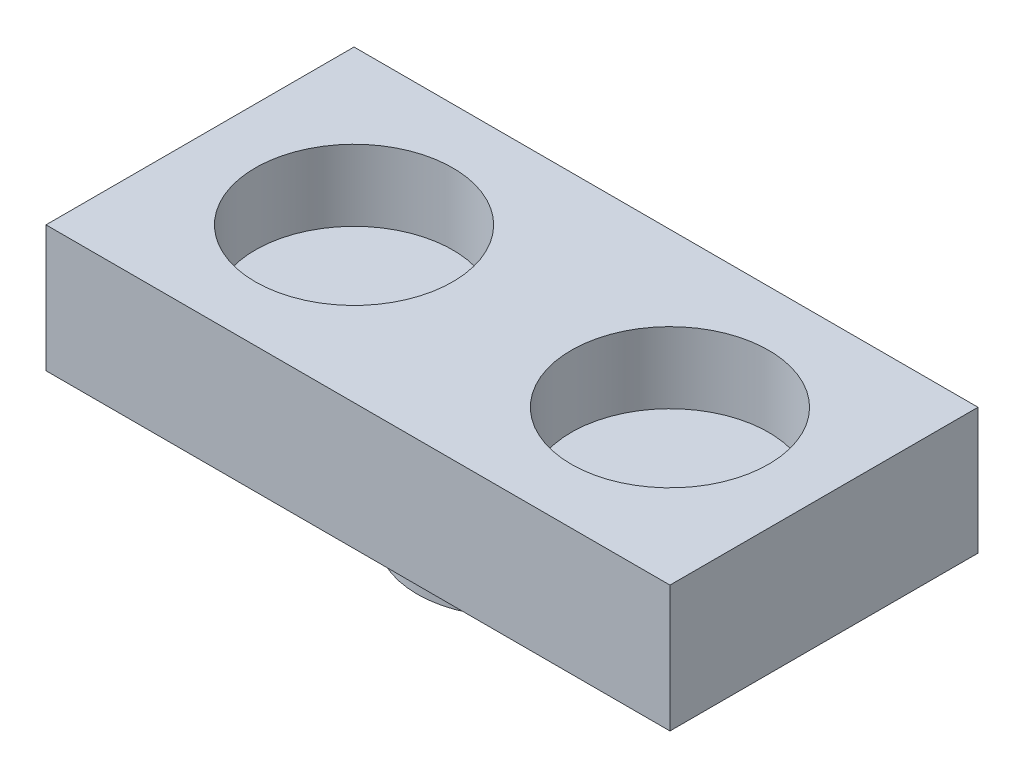
ISO-10303-21;
HEADER;
FILE_DESCRIPTION(('STEP AP214'),'2;1');
FILE_NAME('part.step','',(''),(''),'','','');
FILE_SCHEMA(('AUTOMOTIVE_DESIGN { 1 0 10303 214 1 1 1 1 }'));
ENDSEC;
DATA;
#1=APPLICATION_CONTEXT('core data for automotive mechanical design processes');
#2=APPLICATION_PROTOCOL_DEFINITION('international standard','automotive_design',2000,#1);
#3=PRODUCT_CONTEXT('',#1,'mechanical');
#4=PRODUCT('Part','Part','',(#3));
#5=PRODUCT_RELATED_PRODUCT_CATEGORY('part','',(#4));
#6=PRODUCT_DEFINITION_FORMATION('','',#4);
#7=PRODUCT_DEFINITION_CONTEXT('part definition',#1,'design');
#8=PRODUCT_DEFINITION('design','',#6,#7);
#9=PRODUCT_DEFINITION_SHAPE('','',#8);
#10=(LENGTH_UNIT() NAMED_UNIT(*) SI_UNIT(.MILLI.,.METRE.));
#11=(NAMED_UNIT(*) PLANE_ANGLE_UNIT() SI_UNIT($,.RADIAN.));
#12=(NAMED_UNIT(*) SI_UNIT($,.STERADIAN.) SOLID_ANGLE_UNIT());
#13=UNCERTAINTY_MEASURE_WITH_UNIT(LENGTH_MEASURE(1.E-05),#10,'distance_accuracy_value','');
#14=(GEOMETRIC_REPRESENTATION_CONTEXT(3) GLOBAL_UNCERTAINTY_ASSIGNED_CONTEXT((#13)) GLOBAL_UNIT_ASSIGNED_CONTEXT((#10,
#11,#12)) REPRESENTATION_CONTEXT('',''));
#15=CARTESIAN_POINT('',(0.,0.,0.));
#16=DIRECTION('',(0.,0.,1.));
#17=DIRECTION('',(1.,0.,0.));
#18=AXIS2_PLACEMENT_3D('',#15,#16,#17);
#19=CARTESIAN_POINT('',(-7.9,3.2,0.));
#20=DIRECTION('',(-1.,0.,0.));
#21=DIRECTION('',(0.,0.,1.));
#22=AXIS2_PLACEMENT_3D('',#19,#20,#21);
#23=PLANE('',#22);
#24=DIRECTION('',(0.,0.,-1.));
#25=VECTOR('',#24,1.);
#26=CARTESIAN_POINT('',(-7.9,0.,0.));
#27=LINE('',#26,#25);
#28=CARTESIAN_POINT('',(-7.9,0.,3.9));
#29=VERTEX_POINT('',#28);
#30=CARTESIAN_POINT('',(-7.9,0.,-3.9));
#31=VERTEX_POINT('',#30);
#32=EDGE_CURVE('E156',#29,#31,#27,.T.);
#33=ORIENTED_EDGE('',*,*,#32,.F.);
#34=DIRECTION('',(0.,-1.,0.));
#35=VECTOR('',#34,1.);
#36=CARTESIAN_POINT('',(-7.9,3.2,3.9));
#37=LINE('',#36,#35);
#38=CARTESIAN_POINT('',(-7.9,3.2,3.9));
#39=VERTEX_POINT('',#38);
#40=EDGE_CURVE('E97',#39,#29,#37,.T.);
#41=ORIENTED_EDGE('',*,*,#40,.F.);
#42=DIRECTION('',(0.,0.,-1.));
#43=VECTOR('',#42,1.);
#44=CARTESIAN_POINT('',(-7.9,3.2,0.));
#45=LINE('',#44,#43);
#46=CARTESIAN_POINT('',(-7.9,3.2,-3.9));
#47=VERTEX_POINT('',#46);
#48=EDGE_CURVE('E149',#39,#47,#45,.T.);
#49=ORIENTED_EDGE('',*,*,#48,.T.);
#50=DIRECTION('',(0.,-1.,0.));
#51=VECTOR('',#50,1.);
#52=CARTESIAN_POINT('',(-7.9,3.2,-3.9));
#53=LINE('',#52,#51);
#54=EDGE_CURVE('E128',#47,#31,#53,.T.);
#55=ORIENTED_EDGE('',*,*,#54,.T.);
#56=EDGE_LOOP('',(#33,#41,#49,#55));
#57=FACE_BOUND('',#56,.T.);
#58=ADVANCED_FACE('F89',(#57),#23,.T.);
#59=CARTESIAN_POINT('',(0.,0.,0.));
#60=DIRECTION('',(0.,1.,0.));
#61=DIRECTION('',(0.,0.,1.));
#62=AXIS2_PLACEMENT_3D('',#59,#60,#61);
#63=PLANE('',#62);
#64=CARTESIAN_POINT('',(0.,0.,0.));
#65=DIRECTION('',(0.,1.,0.));
#66=DIRECTION('',(0.,0.,1.));
#67=AXIS2_PLACEMENT_3D('',#64,#65,#66);
#68=CIRCLE('',#67,2.4);
#69=CARTESIAN_POINT('',(0.,0.,2.4));
#70=VERTEX_POINT('',#69);
#71=EDGE_CURVE('E220',#70,#70,#68,.T.);
#72=ORIENTED_EDGE('',*,*,#71,.T.);
#73=EDGE_LOOP('',(#72));
#74=FACE_BOUND('',#73,.T.);
#75=ORIENTED_EDGE('',*,*,#32,.T.);
#76=DIRECTION('',(-1.,0.,0.));
#77=VECTOR('',#76,1.);
#78=CARTESIAN_POINT('',(0.,0.,-3.9));
#79=LINE('',#78,#77);
#80=CARTESIAN_POINT('',(7.9,0.,-3.9));
#81=VERTEX_POINT('',#80);
#82=EDGE_CURVE('E151',#81,#31,#79,.T.);
#83=ORIENTED_EDGE('',*,*,#82,.F.);
#84=DIRECTION('',(0.,0.,-1.));
#85=VECTOR('',#84,1.);
#86=CARTESIAN_POINT('',(7.9,0.,0.));
#87=LINE('',#86,#85);
#88=CARTESIAN_POINT('',(7.9,0.,3.9));
#89=VERTEX_POINT('',#88);
#90=EDGE_CURVE('E121',#89,#81,#87,.T.);
#91=ORIENTED_EDGE('',*,*,#90,.F.);
#92=DIRECTION('',(-1.,0.,0.));
#93=VECTOR('',#92,1.);
#94=CARTESIAN_POINT('',(0.,0.,3.9));
#95=LINE('',#94,#93);
#96=EDGE_CURVE('E142',#89,#29,#95,.T.);
#97=ORIENTED_EDGE('',*,*,#96,.T.);
#98=EDGE_LOOP('',(#75,#83,#91,#97));
#99=FACE_BOUND('',#98,.T.);
#100=ADVANCED_FACE('F166',(#74,#99),#63,.F.);
#101=CARTESIAN_POINT('',(0.,3.2,3.9));
#102=DIRECTION('',(0.,0.,1.));
#103=DIRECTION('',(1.,0.,0.));
#104=AXIS2_PLACEMENT_3D('',#101,#102,#103);
#105=PLANE('',#104);
#106=ORIENTED_EDGE('',*,*,#96,.F.);
#107=DIRECTION('',(0.,-1.,0.));
#108=VECTOR('',#107,1.);
#109=CARTESIAN_POINT('',(7.9,3.2,3.9));
#110=LINE('',#109,#108);
#111=CARTESIAN_POINT('',(7.9,3.2,3.9));
#112=VERTEX_POINT('',#111);
#113=EDGE_CURVE('E136',#112,#89,#110,.T.);
#114=ORIENTED_EDGE('',*,*,#113,.F.);
#115=DIRECTION('',(-1.,0.,0.));
#116=VECTOR('',#115,1.);
#117=CARTESIAN_POINT('',(0.,3.2,3.9));
#118=LINE('',#117,#116);
#119=EDGE_CURVE('E140',#112,#39,#118,.T.);
#120=ORIENTED_EDGE('',*,*,#119,.T.);
#121=ORIENTED_EDGE('',*,*,#40,.T.);
#122=EDGE_LOOP('',(#106,#114,#120,#121));
#123=FACE_BOUND('',#122,.T.);
#124=ADVANCED_FACE('F138',(#123),#105,.T.);
#125=CARTESIAN_POINT('',(7.9,3.2,0.));
#126=DIRECTION('',(-1.,0.,0.));
#127=DIRECTION('',(0.,0.,1.));
#128=AXIS2_PLACEMENT_3D('',#125,#126,#127);
#129=PLANE('',#128);
#130=ORIENTED_EDGE('',*,*,#90,.T.);
#131=DIRECTION('',(0.,-1.,0.));
#132=VECTOR('',#131,1.);
#133=CARTESIAN_POINT('',(7.9,3.2,-3.9));
#134=LINE('',#133,#132);
#135=CARTESIAN_POINT('',(7.9,3.2,-3.9));
#136=VERTEX_POINT('',#135);
#137=EDGE_CURVE('E143',#136,#81,#134,.T.);
#138=ORIENTED_EDGE('',*,*,#137,.F.);
#139=DIRECTION('',(0.,0.,-1.));
#140=VECTOR('',#139,1.);
#141=CARTESIAN_POINT('',(7.9,3.2,0.));
#142=LINE('',#141,#140);
#143=EDGE_CURVE('E145',#112,#136,#142,.T.);
#144=ORIENTED_EDGE('',*,*,#143,.F.);
#145=ORIENTED_EDGE('',*,*,#113,.T.);
#146=EDGE_LOOP('',(#130,#138,#144,#145));
#147=FACE_BOUND('',#146,.T.);
#148=ADVANCED_FACE('F146',(#147),#129,.F.);
#149=CARTESIAN_POINT('',(0.,3.2,-3.9));
#150=DIRECTION('',(0.,0.,1.));
#151=DIRECTION('',(1.,0.,0.));
#152=AXIS2_PLACEMENT_3D('',#149,#150,#151);
#153=PLANE('',#152);
#154=ORIENTED_EDGE('',*,*,#82,.T.);
#155=ORIENTED_EDGE('',*,*,#54,.F.);
#156=DIRECTION('',(-1.,0.,0.));
#157=VECTOR('',#156,1.);
#158=CARTESIAN_POINT('',(0.,3.2,-3.9));
#159=LINE('',#158,#157);
#160=EDGE_CURVE('E105',#136,#47,#159,.T.);
#161=ORIENTED_EDGE('',*,*,#160,.F.);
#162=ORIENTED_EDGE('',*,*,#137,.T.);
#163=EDGE_LOOP('',(#154,#155,#161,#162));
#164=FACE_BOUND('',#163,.T.);
#165=ADVANCED_FACE('F168',(#164),#153,.F.);
#166=CARTESIAN_POINT('',(0.,3.2,0.));
#167=DIRECTION('',(0.,1.,0.));
#168=DIRECTION('',(0.,0.,1.));
#169=AXIS2_PLACEMENT_3D('',#166,#167,#168);
#170=PLANE('',#169);
#171=CARTESIAN_POINT('',(-4.,3.2,0.));
#172=DIRECTION('',(0.,1.,0.));
#173=DIRECTION('',(0.,0.,1.));
#174=AXIS2_PLACEMENT_3D('',#171,#172,#173);
#175=CIRCLE('',#174,2.5);
#176=CARTESIAN_POINT('',(-4.,3.2,2.5));
#177=VERTEX_POINT('',#176);
#178=EDGE_CURVE('E233',#177,#177,#175,.T.);
#179=ORIENTED_EDGE('',*,*,#178,.F.);
#180=EDGE_LOOP('',(#179));
#181=FACE_BOUND('',#180,.T.);
#182=CARTESIAN_POINT('',(4.,3.2,0.));
#183=DIRECTION('',(0.,1.,0.));
#184=DIRECTION('',(0.,0.,1.));
#185=AXIS2_PLACEMENT_3D('',#182,#183,#184);
#186=CIRCLE('',#185,2.5);
#187=CARTESIAN_POINT('',(4.,3.2,2.5));
#188=VERTEX_POINT('',#187);
#189=EDGE_CURVE('E230',#188,#188,#186,.T.);
#190=ORIENTED_EDGE('',*,*,#189,.F.);
#191=EDGE_LOOP('',(#190));
#192=FACE_BOUND('',#191,.T.);
#193=ORIENTED_EDGE('',*,*,#48,.F.);
#194=ORIENTED_EDGE('',*,*,#119,.F.);
#195=ORIENTED_EDGE('',*,*,#143,.T.);
#196=ORIENTED_EDGE('',*,*,#160,.T.);
#197=EDGE_LOOP('',(#193,#194,#195,#196));
#198=FACE_BOUND('',#197,.T.);
#199=ADVANCED_FACE('F148',(#181,#192,#198),#170,.T.);
#200=CARTESIAN_POINT('',(0.,-1.7,0.));
#201=DIRECTION('',(0.,1.,0.));
#202=DIRECTION('',(0.,0.,1.));
#203=AXIS2_PLACEMENT_3D('',#200,#201,#202);
#204=CYLINDRICAL_SURFACE('',#203,2.4);
#205=CARTESIAN_POINT('',(0.,-1.7,0.));
#206=DIRECTION('',(0.,1.,0.));
#207=DIRECTION('',(0.,0.,1.));
#208=AXIS2_PLACEMENT_3D('',#205,#206,#207);
#209=CIRCLE('',#208,2.4);
#210=CARTESIAN_POINT('',(0.,-1.7,2.4));
#211=VERTEX_POINT('',#210);
#212=EDGE_CURVE('E159',#211,#211,#209,.T.);
#213=ORIENTED_EDGE('',*,*,#212,.T.);
#214=EDGE_LOOP('',(#213));
#215=FACE_BOUND('',#214,.T.);
#216=ORIENTED_EDGE('',*,*,#71,.F.);
#217=EDGE_LOOP('',(#216));
#218=FACE_BOUND('',#217,.T.);
#219=ADVANCED_FACE('F175',(#215,#218),#204,.T.);
#220=CARTESIAN_POINT('',(0.,-1.7,0.));
#221=DIRECTION('',(0.,1.,0.));
#222=DIRECTION('',(0.,0.,1.));
#223=AXIS2_PLACEMENT_3D('',#220,#221,#222);
#224=PLANE('',#223);
#225=CARTESIAN_POINT('',(0.,-1.7,0.));
#226=DIRECTION('',(0.,1.,0.));
#227=DIRECTION('',(0.,0.,1.));
#228=AXIS2_PLACEMENT_3D('',#225,#226,#227);
#229=CIRCLE('',#228,1.6);
#230=CARTESIAN_POINT('',(0.,-1.7,1.6));
#231=VERTEX_POINT('',#230);
#232=EDGE_CURVE('E221',#231,#231,#229,.T.);
#233=ORIENTED_EDGE('',*,*,#232,.T.);
#234=EDGE_LOOP('',(#233));
#235=FACE_BOUND('',#234,.T.);
#236=ORIENTED_EDGE('',*,*,#212,.F.);
#237=EDGE_LOOP('',(#236));
#238=FACE_BOUND('',#237,.T.);
#239=ADVANCED_FACE('F199',(#235,#238),#224,.F.);
#240=CARTESIAN_POINT('',(0.,-1.7,0.));
#241=DIRECTION('',(0.,1.,0.));
#242=DIRECTION('',(0.,0.,1.));
#243=AXIS2_PLACEMENT_3D('',#240,#241,#242);
#244=CYLINDRICAL_SURFACE('',#243,1.6);
#245=ORIENTED_EDGE('',*,*,#232,.F.);
#246=EDGE_LOOP('',(#245));
#247=FACE_BOUND('',#246,.T.);
#248=CARTESIAN_POINT('',(0.,0.,0.));
#249=DIRECTION('',(0.,1.,0.));
#250=DIRECTION('',(0.,0.,1.));
#251=AXIS2_PLACEMENT_3D('',#248,#249,#250);
#252=CIRCLE('',#251,1.6);
#253=CARTESIAN_POINT('',(0.,0.,1.6));
#254=VERTEX_POINT('',#253);
#255=EDGE_CURVE('E12',#254,#254,#252,.T.);
#256=ORIENTED_EDGE('',*,*,#255,.T.);
#257=EDGE_LOOP('',(#256));
#258=FACE_BOUND('',#257,.T.);
#259=ADVANCED_FACE('F190',(#247,#258),#244,.F.);
#260=ORIENTED_EDGE('',*,*,#255,.F.);
#261=EDGE_LOOP('',(#260));
#262=FACE_BOUND('',#261,.T.);
#263=ADVANCED_FACE('F182',(#262),#63,.F.);
#264=CARTESIAN_POINT('',(4.,1.4,0.));
#265=DIRECTION('',(0.,1.,0.));
#266=DIRECTION('',(0.,0.,1.));
#267=AXIS2_PLACEMENT_3D('',#264,#265,#266);
#268=CYLINDRICAL_SURFACE('',#267,2.5);
#269=CARTESIAN_POINT('',(4.,1.4,0.));
#270=DIRECTION('',(0.,1.,0.));
#271=DIRECTION('',(0.,0.,1.));
#272=AXIS2_PLACEMENT_3D('',#269,#270,#271);
#273=CIRCLE('',#272,2.5);
#274=CARTESIAN_POINT('',(4.,1.4,2.5));
#275=VERTEX_POINT('',#274);
#276=EDGE_CURVE('E227',#275,#275,#273,.T.);
#277=ORIENTED_EDGE('',*,*,#276,.F.);
#278=EDGE_LOOP('',(#277));
#279=FACE_BOUND('',#278,.T.);
#280=ORIENTED_EDGE('',*,*,#189,.T.);
#281=EDGE_LOOP('',(#280));
#282=FACE_BOUND('',#281,.T.);
#283=ADVANCED_FACE('F189',(#279,#282),#268,.F.);
#284=CARTESIAN_POINT('',(4.,1.4,0.));
#285=DIRECTION('',(0.,1.,0.));
#286=DIRECTION('',(0.,0.,1.));
#287=AXIS2_PLACEMENT_3D('',#284,#285,#286);
#288=PLANE('',#287);
#289=ORIENTED_EDGE('',*,*,#276,.T.);
#290=EDGE_LOOP('',(#289));
#291=FACE_BOUND('',#290,.T.);
#292=ADVANCED_FACE('F196',(#291),#288,.T.);
#293=CARTESIAN_POINT('',(-4.,1.4,0.));
#294=DIRECTION('',(0.,1.,0.));
#295=DIRECTION('',(0.,0.,1.));
#296=AXIS2_PLACEMENT_3D('',#293,#294,#295);
#297=CYLINDRICAL_SURFACE('',#296,2.5);
#298=CARTESIAN_POINT('',(-4.,1.4,0.));
#299=DIRECTION('',(0.,1.,0.));
#300=DIRECTION('',(0.,0.,1.));
#301=AXIS2_PLACEMENT_3D('',#298,#299,#300);
#302=CIRCLE('',#301,2.5);
#303=CARTESIAN_POINT('',(-4.,1.4,2.5));
#304=VERTEX_POINT('',#303);
#305=EDGE_CURVE('E224',#304,#304,#302,.T.);
#306=ORIENTED_EDGE('',*,*,#305,.F.);
#307=EDGE_LOOP('',(#306));
#308=FACE_BOUND('',#307,.T.);
#309=ORIENTED_EDGE('',*,*,#178,.T.);
#310=EDGE_LOOP('',(#309));
#311=FACE_BOUND('',#310,.T.);
#312=ADVANCED_FACE('F241',(#308,#311),#297,.F.);
#313=CARTESIAN_POINT('',(0.,1.4,0.));
#314=DIRECTION('',(0.,1.,0.));
#315=DIRECTION('',(0.,0.,1.));
#316=AXIS2_PLACEMENT_3D('',#313,#314,#315);
#317=PLANE('',#316);
#318=ORIENTED_EDGE('',*,*,#305,.T.);
#319=EDGE_LOOP('',(#318));
#320=FACE_BOUND('',#319,.T.);
#321=ADVANCED_FACE('F239',(#320),#317,.T.);
#322=CLOSED_SHELL('',(#58,#100,#124,#148,#165,#199,#219,#239,#259,#263,#283,#292,#312,#321));
#323=MANIFOLD_SOLID_BREP('B2',#322);
#324=ADVANCED_BREP_SHAPE_REPRESENTATION('',(#18,#323),#14);
#325=SHAPE_DEFINITION_REPRESENTATION(#9,#324);
ENDSEC;
END-ISO-10303-21;
